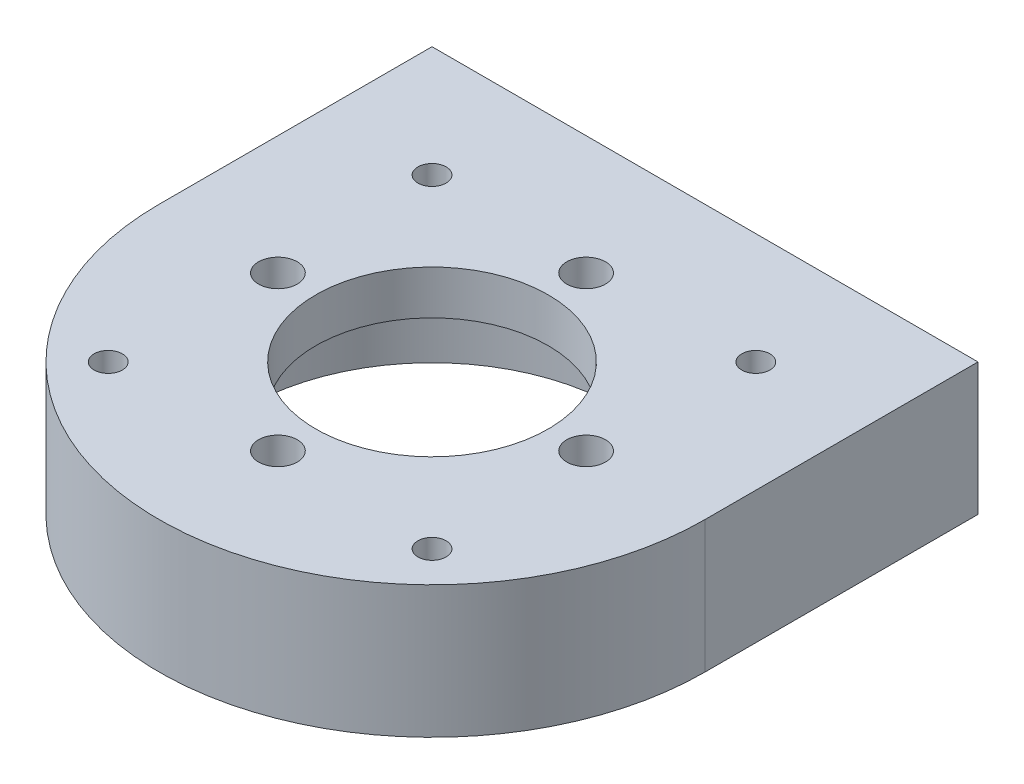
ISO-10303-21;
HEADER;
FILE_DESCRIPTION(('STEP AP214'),'2;1');
FILE_NAME('part.step','',(''),(''),'','','');
FILE_SCHEMA(('AUTOMOTIVE_DESIGN { 1 0 10303 214 1 1 1 1 }'));
ENDSEC;
DATA;
#1=APPLICATION_CONTEXT('core data for automotive mechanical design processes');
#2=APPLICATION_PROTOCOL_DEFINITION('international standard','automotive_design',2000,#1);
#3=PRODUCT_CONTEXT('',#1,'mechanical');
#4=PRODUCT('Part','Part','',(#3));
#5=PRODUCT_RELATED_PRODUCT_CATEGORY('part','',(#4));
#6=PRODUCT_DEFINITION_FORMATION('','',#4);
#7=PRODUCT_DEFINITION_CONTEXT('part definition',#1,'design');
#8=PRODUCT_DEFINITION('design','',#6,#7);
#9=PRODUCT_DEFINITION_SHAPE('','',#8);
#10=(LENGTH_UNIT() NAMED_UNIT(*) SI_UNIT(.MILLI.,.METRE.));
#11=(NAMED_UNIT(*) PLANE_ANGLE_UNIT() SI_UNIT($,.RADIAN.));
#12=(NAMED_UNIT(*) SI_UNIT($,.STERADIAN.) SOLID_ANGLE_UNIT());
#13=UNCERTAINTY_MEASURE_WITH_UNIT(LENGTH_MEASURE(1.E-05),#10,'distance_accuracy_value','');
#14=(GEOMETRIC_REPRESENTATION_CONTEXT(3) GLOBAL_UNCERTAINTY_ASSIGNED_CONTEXT((#13)) GLOBAL_UNIT_ASSIGNED_CONTEXT((#10,
#11,#12)) REPRESENTATION_CONTEXT('',''));
#15=CARTESIAN_POINT('',(0.,0.,0.));
#16=DIRECTION('',(0.,0.,1.));
#17=DIRECTION('',(1.,0.,0.));
#18=AXIS2_PLACEMENT_3D('',#15,#16,#17);
#19=CARTESIAN_POINT('',(0.,15.,0.));
#20=DIRECTION('',(0.,-1.,0.));
#21=DIRECTION('',(0.,0.,-1.));
#22=AXIS2_PLACEMENT_3D('',#19,#20,#21);
#23=CYLINDRICAL_SURFACE('',#22,31.);
#24=CARTESIAN_POINT('',(0.,0.,0.));
#25=DIRECTION('',(0.,1.,0.));
#26=DIRECTION('',(0.,0.,1.));
#27=AXIS2_PLACEMENT_3D('',#24,#25,#26);
#28=CIRCLE('',#27,31.);
#29=CARTESIAN_POINT('',(-31.,0.,0.));
#30=VERTEX_POINT('',#29);
#31=CARTESIAN_POINT('',(31.,0.,0.));
#32=VERTEX_POINT('',#31);
#33=EDGE_CURVE('E141',#30,#32,#28,.T.);
#34=ORIENTED_EDGE('',*,*,#33,.T.);
#35=DIRECTION('',(0.,-1.,0.));
#36=VECTOR('',#35,1.);
#37=CARTESIAN_POINT('',(31.,15.,0.));
#38=LINE('',#37,#36);
#39=CARTESIAN_POINT('',(31.,15.,0.));
#40=VERTEX_POINT('',#39);
#41=EDGE_CURVE('E57',#40,#32,#38,.T.);
#42=ORIENTED_EDGE('',*,*,#41,.F.);
#43=CARTESIAN_POINT('',(0.,15.,0.));
#44=DIRECTION('',(0.,1.,0.));
#45=DIRECTION('',(0.,0.,1.));
#46=AXIS2_PLACEMENT_3D('',#43,#44,#45);
#47=CIRCLE('',#46,31.);
#48=CARTESIAN_POINT('',(-31.,15.,0.));
#49=VERTEX_POINT('',#48);
#50=EDGE_CURVE('E90',#49,#40,#47,.T.);
#51=ORIENTED_EDGE('',*,*,#50,.F.);
#52=DIRECTION('',(0.,-1.,0.));
#53=VECTOR('',#52,1.);
#54=CARTESIAN_POINT('',(-31.,15.,0.));
#55=LINE('',#54,#53);
#56=EDGE_CURVE('E65',#49,#30,#55,.T.);
#57=ORIENTED_EDGE('',*,*,#56,.T.);
#58=EDGE_LOOP('',(#34,#42,#51,#57));
#59=FACE_BOUND('',#58,.T.);
#60=ADVANCED_FACE('F47',(#59),#23,.T.);
#61=CARTESIAN_POINT('',(31.,15.,0.));
#62=DIRECTION('',(1.,0.,0.));
#63=DIRECTION('',(0.,0.,-1.));
#64=AXIS2_PLACEMENT_3D('',#61,#62,#63);
#65=PLANE('',#64);
#66=DIRECTION('',(0.,0.,1.));
#67=VECTOR('',#66,1.);
#68=CARTESIAN_POINT('',(31.,0.,0.));
#69=LINE('',#68,#67);
#70=CARTESIAN_POINT('',(31.,0.,-31.));
#71=VERTEX_POINT('',#70);
#72=EDGE_CURVE('E100',#71,#32,#69,.T.);
#73=ORIENTED_EDGE('',*,*,#72,.F.);
#74=DIRECTION('',(0.,-1.,0.));
#75=VECTOR('',#74,1.);
#76=CARTESIAN_POINT('',(31.,15.,-31.));
#77=LINE('',#76,#75);
#78=CARTESIAN_POINT('',(31.,15.,-31.));
#79=VERTEX_POINT('',#78);
#80=EDGE_CURVE('E96',#79,#71,#77,.T.);
#81=ORIENTED_EDGE('',*,*,#80,.F.);
#82=DIRECTION('',(0.,0.,1.));
#83=VECTOR('',#82,1.);
#84=CARTESIAN_POINT('',(31.,15.,0.));
#85=LINE('',#84,#83);
#86=EDGE_CURVE('E98',#79,#40,#85,.T.);
#87=ORIENTED_EDGE('',*,*,#86,.T.);
#88=ORIENTED_EDGE('',*,*,#41,.T.);
#89=EDGE_LOOP('',(#73,#81,#87,#88));
#90=FACE_BOUND('',#89,.T.);
#91=ADVANCED_FACE('F97',(#90),#65,.T.);
#92=CARTESIAN_POINT('',(0.,15.,-31.));
#93=DIRECTION('',(0.,0.,-1.));
#94=DIRECTION('',(-1.,0.,0.));
#95=AXIS2_PLACEMENT_3D('',#92,#93,#94);
#96=PLANE('',#95);
#97=DIRECTION('',(1.,0.,0.));
#98=VECTOR('',#97,1.);
#99=CARTESIAN_POINT('',(0.,0.,-31.));
#100=LINE('',#99,#98);
#101=CARTESIAN_POINT('',(-31.,0.,-31.));
#102=VERTEX_POINT('',#101);
#103=EDGE_CURVE('E146',#102,#71,#100,.T.);
#104=ORIENTED_EDGE('',*,*,#103,.F.);
#105=DIRECTION('',(0.,-1.,0.));
#106=VECTOR('',#105,1.);
#107=CARTESIAN_POINT('',(-31.,15.,-31.));
#108=LINE('',#107,#106);
#109=CARTESIAN_POINT('',(-31.,15.,-31.));
#110=VERTEX_POINT('',#109);
#111=EDGE_CURVE('E79',#110,#102,#108,.T.);
#112=ORIENTED_EDGE('',*,*,#111,.F.);
#113=DIRECTION('',(1.,0.,0.));
#114=VECTOR('',#113,1.);
#115=CARTESIAN_POINT('',(0.,15.,-31.));
#116=LINE('',#115,#114);
#117=EDGE_CURVE('E109',#110,#79,#116,.T.);
#118=ORIENTED_EDGE('',*,*,#117,.T.);
#119=ORIENTED_EDGE('',*,*,#80,.T.);
#120=EDGE_LOOP('',(#104,#112,#118,#119));
#121=FACE_BOUND('',#120,.T.);
#122=ADVANCED_FACE('F112',(#121),#96,.T.);
#123=CARTESIAN_POINT('',(0.,15.,0.));
#124=DIRECTION('',(0.,-1.,0.));
#125=DIRECTION('',(0.,0.,-1.));
#126=AXIS2_PLACEMENT_3D('',#123,#124,#125);
#127=CYLINDRICAL_SURFACE('',#126,21.1);
#128=CARTESIAN_POINT('',(0.,10.,0.));
#129=DIRECTION('',(0.,-1.,0.));
#130=DIRECTION('',(0.,0.,-1.));
#131=AXIS2_PLACEMENT_3D('',#128,#129,#130);
#132=CIRCLE('',#131,21.1);
#133=CARTESIAN_POINT('',(0.,10.,-21.1));
#134=VERTEX_POINT('',#133);
#135=EDGE_CURVE('E11',#134,#134,#132,.T.);
#136=ORIENTED_EDGE('',*,*,#135,.F.);
#137=EDGE_LOOP('',(#136));
#138=FACE_BOUND('',#137,.T.);
#139=CARTESIAN_POINT('',(0.,0.,0.));
#140=DIRECTION('',(0.,1.,0.));
#141=DIRECTION('',(0.,0.,1.));
#142=AXIS2_PLACEMENT_3D('',#139,#140,#141);
#143=CIRCLE('',#142,21.1);
#144=CARTESIAN_POINT('',(0.,0.,21.1));
#145=VERTEX_POINT('',#144);
#146=EDGE_CURVE('E137',#145,#145,#143,.T.);
#147=ORIENTED_EDGE('',*,*,#146,.F.);
#148=EDGE_LOOP('',(#147));
#149=FACE_BOUND('',#148,.T.);
#150=ADVANCED_FACE('F181',(#138,#149),#127,.F.);
#151=CARTESIAN_POINT('',(18.3847763108503,15.,-18.3847763108502));
#152=DIRECTION('',(0.,-1.,0.));
#153=DIRECTION('',(0.,0.,-1.));
#154=AXIS2_PLACEMENT_3D('',#151,#152,#153);
#155=CYLINDRICAL_SURFACE('',#154,1.60000000000001);
#156=CARTESIAN_POINT('',(18.3847763108503,15.,-18.3847763108502));
#157=DIRECTION('',(0.,1.,0.));
#158=DIRECTION('',(0.,0.,1.));
#159=AXIS2_PLACEMENT_3D('',#156,#157,#158);
#160=CIRCLE('',#159,1.60000000000001);
#161=CARTESIAN_POINT('',(18.3847763108503,15.,-16.7847763108502));
#162=VERTEX_POINT('',#161);
#163=EDGE_CURVE('E292',#162,#162,#160,.T.);
#164=ORIENTED_EDGE('',*,*,#163,.T.);
#165=EDGE_LOOP('',(#164));
#166=FACE_BOUND('',#165,.T.);
#167=CARTESIAN_POINT('',(18.3847763108503,0.,-18.3847763108502));
#168=DIRECTION('',(0.,1.,0.));
#169=DIRECTION('',(0.,0.,1.));
#170=AXIS2_PLACEMENT_3D('',#167,#168,#169);
#171=CIRCLE('',#170,1.60000000000001);
#172=CARTESIAN_POINT('',(18.3847763108503,0.,-16.7847763108502));
#173=VERTEX_POINT('',#172);
#174=EDGE_CURVE('E133',#173,#173,#171,.T.);
#175=ORIENTED_EDGE('',*,*,#174,.F.);
#176=EDGE_LOOP('',(#175));
#177=FACE_BOUND('',#176,.T.);
#178=ADVANCED_FACE('F184',(#166,#177),#155,.F.);
#179=CARTESIAN_POINT('',(18.3847763108501,15.,18.3847763108503));
#180=DIRECTION('',(0.,-1.,0.));
#181=DIRECTION('',(0.,0.,-1.));
#182=AXIS2_PLACEMENT_3D('',#179,#180,#181);
#183=CYLINDRICAL_SURFACE('',#182,1.6);
#184=CARTESIAN_POINT('',(18.3847763108501,15.,18.3847763108503));
#185=DIRECTION('',(0.,1.,0.));
#186=DIRECTION('',(0.,0.,1.));
#187=AXIS2_PLACEMENT_3D('',#184,#185,#186);
#188=CIRCLE('',#187,1.6);
#189=CARTESIAN_POINT('',(18.3847763108501,15.,19.9847763108503));
#190=VERTEX_POINT('',#189);
#191=EDGE_CURVE('E288',#190,#190,#188,.T.);
#192=ORIENTED_EDGE('',*,*,#191,.T.);
#193=EDGE_LOOP('',(#192));
#194=FACE_BOUND('',#193,.T.);
#195=CARTESIAN_POINT('',(18.3847763108501,0.,18.3847763108503));
#196=DIRECTION('',(0.,1.,0.));
#197=DIRECTION('',(0.,0.,1.));
#198=AXIS2_PLACEMENT_3D('',#195,#196,#197);
#199=CIRCLE('',#198,1.6);
#200=CARTESIAN_POINT('',(18.3847763108501,0.,19.9847763108503));
#201=VERTEX_POINT('',#200);
#202=EDGE_CURVE('E129',#201,#201,#199,.T.);
#203=ORIENTED_EDGE('',*,*,#202,.F.);
#204=EDGE_LOOP('',(#203));
#205=FACE_BOUND('',#204,.T.);
#206=ADVANCED_FACE('F188',(#194,#205),#183,.F.);
#207=CARTESIAN_POINT('',(-18.3847763108504,15.,18.3847763108501));
#208=DIRECTION('',(0.,-1.,0.));
#209=DIRECTION('',(0.,0.,-1.));
#210=AXIS2_PLACEMENT_3D('',#207,#208,#209);
#211=CYLINDRICAL_SURFACE('',#210,1.6);
#212=CARTESIAN_POINT('',(-18.3847763108504,15.,18.3847763108501));
#213=DIRECTION('',(0.,1.,0.));
#214=DIRECTION('',(0.,0.,1.));
#215=AXIS2_PLACEMENT_3D('',#212,#213,#214);
#216=CIRCLE('',#215,1.6);
#217=CARTESIAN_POINT('',(-18.3847763108504,15.,19.9847763108501));
#218=VERTEX_POINT('',#217);
#219=EDGE_CURVE('E199',#218,#218,#216,.T.);
#220=ORIENTED_EDGE('',*,*,#219,.T.);
#221=EDGE_LOOP('',(#220));
#222=FACE_BOUND('',#221,.T.);
#223=CARTESIAN_POINT('',(-18.3847763108504,0.,18.3847763108501));
#224=DIRECTION('',(0.,1.,0.));
#225=DIRECTION('',(0.,0.,1.));
#226=AXIS2_PLACEMENT_3D('',#223,#224,#225);
#227=CIRCLE('',#226,1.6);
#228=CARTESIAN_POINT('',(-18.3847763108504,0.,19.9847763108501));
#229=VERTEX_POINT('',#228);
#230=EDGE_CURVE('E124',#229,#229,#227,.T.);
#231=ORIENTED_EDGE('',*,*,#230,.F.);
#232=EDGE_LOOP('',(#231));
#233=FACE_BOUND('',#232,.T.);
#234=ADVANCED_FACE('F170',(#222,#233),#211,.F.);
#235=CARTESIAN_POINT('',(-18.38477631085,15.,-18.3847763108505));
#236=DIRECTION('',(0.,-1.,0.));
#237=DIRECTION('',(0.,0.,-1.));
#238=AXIS2_PLACEMENT_3D('',#235,#236,#237);
#239=CYLINDRICAL_SURFACE('',#238,1.6);
#240=CARTESIAN_POINT('',(-18.38477631085,15.,-18.3847763108505));
#241=DIRECTION('',(0.,1.,0.));
#242=DIRECTION('',(0.,0.,1.));
#243=AXIS2_PLACEMENT_3D('',#240,#241,#242);
#244=CIRCLE('',#243,1.6);
#245=CARTESIAN_POINT('',(-18.38477631085,15.,-16.7847763108505));
#246=VERTEX_POINT('',#245);
#247=EDGE_CURVE('E153',#246,#246,#244,.T.);
#248=ORIENTED_EDGE('',*,*,#247,.T.);
#249=EDGE_LOOP('',(#248));
#250=FACE_BOUND('',#249,.T.);
#251=CARTESIAN_POINT('',(-18.38477631085,0.,-18.3847763108505));
#252=DIRECTION('',(0.,1.,0.));
#253=DIRECTION('',(0.,0.,1.));
#254=AXIS2_PLACEMENT_3D('',#251,#252,#253);
#255=CIRCLE('',#254,1.6);
#256=CARTESIAN_POINT('',(-18.38477631085,0.,-16.7847763108505));
#257=VERTEX_POINT('',#256);
#258=EDGE_CURVE('E120',#257,#257,#255,.T.);
#259=ORIENTED_EDGE('',*,*,#258,.F.);
#260=EDGE_LOOP('',(#259));
#261=FACE_BOUND('',#260,.T.);
#262=ADVANCED_FACE('F49',(#250,#261),#239,.F.);
#263=CARTESIAN_POINT('',(-31.,15.,0.));
#264=DIRECTION('',(-1.,0.,0.));
#265=DIRECTION('',(0.,0.,1.));
#266=AXIS2_PLACEMENT_3D('',#263,#264,#265);
#267=PLANE('',#266);
#268=DIRECTION('',(0.,0.,-1.));
#269=VECTOR('',#268,1.);
#270=CARTESIAN_POINT('',(-31.,0.,0.));
#271=LINE('',#270,#269);
#272=EDGE_CURVE('E149',#30,#102,#271,.T.);
#273=ORIENTED_EDGE('',*,*,#272,.F.);
#274=ORIENTED_EDGE('',*,*,#56,.F.);
#275=DIRECTION('',(0.,0.,-1.));
#276=VECTOR('',#275,1.);
#277=CARTESIAN_POINT('',(-31.,15.,0.));
#278=LINE('',#277,#276);
#279=EDGE_CURVE('E114',#49,#110,#278,.T.);
#280=ORIENTED_EDGE('',*,*,#279,.T.);
#281=ORIENTED_EDGE('',*,*,#111,.T.);
#282=EDGE_LOOP('',(#273,#274,#280,#281));
#283=FACE_BOUND('',#282,.T.);
#284=ADVANCED_FACE('F160',(#283),#267,.T.);
#285=CARTESIAN_POINT('',(0.,15.,0.));
#286=DIRECTION('',(0.,1.,0.));
#287=DIRECTION('',(0.,0.,1.));
#288=AXIS2_PLACEMENT_3D('',#285,#286,#287);
#289=PLANE('',#288);
#290=ORIENTED_EDGE('',*,*,#247,.F.);
#291=EDGE_LOOP('',(#290));
#292=FACE_BOUND('',#291,.T.);
#293=ORIENTED_EDGE('',*,*,#219,.F.);
#294=EDGE_LOOP('',(#293));
#295=FACE_BOUND('',#294,.T.);
#296=ORIENTED_EDGE('',*,*,#191,.F.);
#297=EDGE_LOOP('',(#296));
#298=FACE_BOUND('',#297,.T.);
#299=ORIENTED_EDGE('',*,*,#163,.F.);
#300=EDGE_LOOP('',(#299));
#301=FACE_BOUND('',#300,.T.);
#302=ORIENTED_EDGE('',*,*,#50,.T.);
#303=ORIENTED_EDGE('',*,*,#86,.F.);
#304=ORIENTED_EDGE('',*,*,#117,.F.);
#305=ORIENTED_EDGE('',*,*,#279,.F.);
#306=EDGE_LOOP('',(#302,#303,#304,#305));
#307=FACE_BOUND('',#306,.T.);
#308=CARTESIAN_POINT('',(-17.5,15.,1.83447007584547E-13));
#309=DIRECTION('',(0.,-1.,0.));
#310=DIRECTION('',(0.,0.,-1.));
#311=AXIS2_PLACEMENT_3D('',#308,#309,#310);
#312=CIRCLE('',#311,2.2);
#313=CARTESIAN_POINT('',(-17.5,15.,-2.19999999999982));
#314=VERTEX_POINT('',#313);
#315=EDGE_CURVE('E243',#314,#314,#312,.T.);
#316=ORIENTED_EDGE('',*,*,#315,.T.);
#317=EDGE_LOOP('',(#316));
#318=FACE_BOUND('',#317,.T.);
#319=CARTESIAN_POINT('',(-1.22298005056365E-13,15.,-17.5));
#320=DIRECTION('',(0.,-1.,0.));
#321=DIRECTION('',(0.,0.,-1.));
#322=AXIS2_PLACEMENT_3D('',#319,#320,#321);
#323=CIRCLE('',#322,2.2);
#324=CARTESIAN_POINT('',(-1.22298005056365E-13,15.,-19.7));
#325=VERTEX_POINT('',#324);
#326=EDGE_CURVE('E253',#325,#325,#323,.T.);
#327=ORIENTED_EDGE('',*,*,#326,.T.);
#328=EDGE_LOOP('',(#327));
#329=FACE_BOUND('',#328,.T.);
#330=CARTESIAN_POINT('',(17.5,15.,0.));
#331=DIRECTION('',(0.,-1.,0.));
#332=DIRECTION('',(0.,0.,-1.));
#333=AXIS2_PLACEMENT_3D('',#330,#331,#332);
#334=CIRCLE('',#333,2.2);
#335=CARTESIAN_POINT('',(17.5,15.,-2.20000000000006));
#336=VERTEX_POINT('',#335);
#337=EDGE_CURVE('E261',#336,#336,#334,.T.);
#338=ORIENTED_EDGE('',*,*,#337,.T.);
#339=EDGE_LOOP('',(#338));
#340=FACE_BOUND('',#339,.T.);
#341=CARTESIAN_POINT('',(0.,15.,17.5));
#342=DIRECTION('',(0.,-1.,0.));
#343=DIRECTION('',(0.,0.,-1.));
#344=AXIS2_PLACEMENT_3D('',#341,#342,#343);
#345=CIRCLE('',#344,2.2);
#346=CARTESIAN_POINT('',(0.,15.,15.3));
#347=VERTEX_POINT('',#346);
#348=EDGE_CURVE('E269',#347,#347,#345,.T.);
#349=ORIENTED_EDGE('',*,*,#348,.T.);
#350=EDGE_LOOP('',(#349));
#351=FACE_BOUND('',#350,.T.);
#352=CARTESIAN_POINT('',(0.,15.,0.));
#353=DIRECTION('',(0.,-1.,0.));
#354=DIRECTION('',(0.,0.,-1.));
#355=AXIS2_PLACEMENT_3D('',#352,#353,#354);
#356=CIRCLE('',#355,13.2);
#357=CARTESIAN_POINT('',(0.,15.,-13.2));
#358=VERTEX_POINT('',#357);
#359=EDGE_CURVE('E125',#358,#358,#356,.T.);
#360=ORIENTED_EDGE('',*,*,#359,.T.);
#361=EDGE_LOOP('',(#360));
#362=FACE_BOUND('',#361,.T.);
#363=ADVANCED_FACE('F107',(#292,#295,#298,#301,#307,#318,#329,#340,#351,#362),#289,.T.);
#364=CARTESIAN_POINT('',(0.,0.,0.));
#365=DIRECTION('',(0.,1.,0.));
#366=DIRECTION('',(0.,0.,1.));
#367=AXIS2_PLACEMENT_3D('',#364,#365,#366);
#368=PLANE('',#367);
#369=ORIENTED_EDGE('',*,*,#258,.T.);
#370=EDGE_LOOP('',(#369));
#371=FACE_BOUND('',#370,.T.);
#372=ORIENTED_EDGE('',*,*,#230,.T.);
#373=EDGE_LOOP('',(#372));
#374=FACE_BOUND('',#373,.T.);
#375=ORIENTED_EDGE('',*,*,#202,.T.);
#376=EDGE_LOOP('',(#375));
#377=FACE_BOUND('',#376,.T.);
#378=ORIENTED_EDGE('',*,*,#174,.T.);
#379=EDGE_LOOP('',(#378));
#380=FACE_BOUND('',#379,.T.);
#381=ORIENTED_EDGE('',*,*,#146,.T.);
#382=EDGE_LOOP('',(#381));
#383=FACE_BOUND('',#382,.T.);
#384=ORIENTED_EDGE('',*,*,#33,.F.);
#385=ORIENTED_EDGE('',*,*,#272,.T.);
#386=ORIENTED_EDGE('',*,*,#103,.T.);
#387=ORIENTED_EDGE('',*,*,#72,.T.);
#388=EDGE_LOOP('',(#384,#385,#386,#387));
#389=FACE_BOUND('',#388,.T.);
#390=ADVANCED_FACE('F159',(#371,#374,#377,#380,#383,#389),#368,.F.);
#391=CARTESIAN_POINT('',(0.,10.,0.));
#392=DIRECTION('',(0.,-1.,0.));
#393=DIRECTION('',(0.,0.,-1.));
#394=AXIS2_PLACEMENT_3D('',#391,#392,#393);
#395=PLANE('',#394);
#396=CARTESIAN_POINT('',(-17.5,10.,1.83447007584547E-13));
#397=DIRECTION('',(0.,-1.,0.));
#398=DIRECTION('',(0.,0.,-1.));
#399=AXIS2_PLACEMENT_3D('',#396,#397,#398);
#400=CIRCLE('',#399,2.2);
#401=CARTESIAN_POINT('',(-17.5,10.,-2.19999999999982));
#402=VERTEX_POINT('',#401);
#403=EDGE_CURVE('E246',#402,#402,#400,.T.);
#404=ORIENTED_EDGE('',*,*,#403,.F.);
#405=EDGE_LOOP('',(#404));
#406=FACE_BOUND('',#405,.T.);
#407=CARTESIAN_POINT('',(-1.22298005056365E-13,10.,-17.5));
#408=DIRECTION('',(0.,-1.,0.));
#409=DIRECTION('',(0.,0.,-1.));
#410=AXIS2_PLACEMENT_3D('',#407,#408,#409);
#411=CIRCLE('',#410,2.2);
#412=CARTESIAN_POINT('',(-1.22298005056365E-13,10.,-19.7));
#413=VERTEX_POINT('',#412);
#414=EDGE_CURVE('E250',#413,#413,#411,.T.);
#415=ORIENTED_EDGE('',*,*,#414,.F.);
#416=EDGE_LOOP('',(#415));
#417=FACE_BOUND('',#416,.T.);
#418=CARTESIAN_POINT('',(17.5,10.,0.));
#419=DIRECTION('',(0.,-1.,0.));
#420=DIRECTION('',(0.,0.,-1.));
#421=AXIS2_PLACEMENT_3D('',#418,#419,#420);
#422=CIRCLE('',#421,2.2);
#423=CARTESIAN_POINT('',(17.5,10.,-2.20000000000006));
#424=VERTEX_POINT('',#423);
#425=EDGE_CURVE('E257',#424,#424,#422,.T.);
#426=ORIENTED_EDGE('',*,*,#425,.F.);
#427=EDGE_LOOP('',(#426));
#428=FACE_BOUND('',#427,.T.);
#429=CARTESIAN_POINT('',(0.,10.,17.5));
#430=DIRECTION('',(0.,-1.,0.));
#431=DIRECTION('',(0.,0.,-1.));
#432=AXIS2_PLACEMENT_3D('',#429,#430,#431);
#433=CIRCLE('',#432,2.2);
#434=CARTESIAN_POINT('',(0.,10.,15.3));
#435=VERTEX_POINT('',#434);
#436=EDGE_CURVE('E265',#435,#435,#433,.T.);
#437=ORIENTED_EDGE('',*,*,#436,.F.);
#438=EDGE_LOOP('',(#437));
#439=FACE_BOUND('',#438,.T.);
#440=CARTESIAN_POINT('',(0.,10.,0.));
#441=DIRECTION('',(0.,-1.,0.));
#442=DIRECTION('',(0.,0.,-1.));
#443=AXIS2_PLACEMENT_3D('',#440,#441,#442);
#444=CIRCLE('',#443,13.2);
#445=CARTESIAN_POINT('',(0.,10.,-13.2));
#446=VERTEX_POINT('',#445);
#447=EDGE_CURVE('E273',#446,#446,#444,.T.);
#448=ORIENTED_EDGE('',*,*,#447,.F.);
#449=EDGE_LOOP('',(#448));
#450=FACE_BOUND('',#449,.T.);
#451=ORIENTED_EDGE('',*,*,#135,.T.);
#452=EDGE_LOOP('',(#451));
#453=FACE_BOUND('',#452,.T.);
#454=ADVANCED_FACE('F203',(#406,#417,#428,#439,#450,#453),#395,.T.);
#455=CARTESIAN_POINT('',(0.,15.,0.));
#456=DIRECTION('',(0.,-1.,0.));
#457=DIRECTION('',(0.,0.,-1.));
#458=AXIS2_PLACEMENT_3D('',#455,#456,#457);
#459=CYLINDRICAL_SURFACE('',#458,13.2);
#460=ORIENTED_EDGE('',*,*,#359,.F.);
#461=EDGE_LOOP('',(#460));
#462=FACE_BOUND('',#461,.T.);
#463=ORIENTED_EDGE('',*,*,#447,.T.);
#464=EDGE_LOOP('',(#463));
#465=FACE_BOUND('',#464,.T.);
#466=ADVANCED_FACE('F216',(#462,#465),#459,.F.);
#467=CARTESIAN_POINT('',(0.,15.,17.5));
#468=DIRECTION('',(0.,-1.,0.));
#469=DIRECTION('',(0.,0.,-1.));
#470=AXIS2_PLACEMENT_3D('',#467,#468,#469);
#471=CYLINDRICAL_SURFACE('',#470,2.2);
#472=ORIENTED_EDGE('',*,*,#348,.F.);
#473=EDGE_LOOP('',(#472));
#474=FACE_BOUND('',#473,.T.);
#475=ORIENTED_EDGE('',*,*,#436,.T.);
#476=EDGE_LOOP('',(#475));
#477=FACE_BOUND('',#476,.T.);
#478=ADVANCED_FACE('F222',(#474,#477),#471,.F.);
#479=CARTESIAN_POINT('',(17.5,15.,0.));
#480=DIRECTION('',(0.,-1.,0.));
#481=DIRECTION('',(0.,0.,-1.));
#482=AXIS2_PLACEMENT_3D('',#479,#480,#481);
#483=CYLINDRICAL_SURFACE('',#482,2.2);
#484=ORIENTED_EDGE('',*,*,#337,.F.);
#485=EDGE_LOOP('',(#484));
#486=FACE_BOUND('',#485,.T.);
#487=ORIENTED_EDGE('',*,*,#425,.T.);
#488=EDGE_LOOP('',(#487));
#489=FACE_BOUND('',#488,.T.);
#490=ADVANCED_FACE('F226',(#486,#489),#483,.F.);
#491=CARTESIAN_POINT('',(-1.22298005056365E-13,15.,-17.5));
#492=DIRECTION('',(0.,-1.,0.));
#493=DIRECTION('',(0.,0.,-1.));
#494=AXIS2_PLACEMENT_3D('',#491,#492,#493);
#495=CYLINDRICAL_SURFACE('',#494,2.2);
#496=ORIENTED_EDGE('',*,*,#326,.F.);
#497=EDGE_LOOP('',(#496));
#498=FACE_BOUND('',#497,.T.);
#499=ORIENTED_EDGE('',*,*,#414,.T.);
#500=EDGE_LOOP('',(#499));
#501=FACE_BOUND('',#500,.T.);
#502=ADVANCED_FACE('F230',(#498,#501),#495,.F.);
#503=CARTESIAN_POINT('',(-17.5,15.,1.83447007584547E-13));
#504=DIRECTION('',(0.,-1.,0.));
#505=DIRECTION('',(0.,0.,-1.));
#506=AXIS2_PLACEMENT_3D('',#503,#504,#505);
#507=CYLINDRICAL_SURFACE('',#506,2.2);
#508=ORIENTED_EDGE('',*,*,#315,.F.);
#509=EDGE_LOOP('',(#508));
#510=FACE_BOUND('',#509,.T.);
#511=ORIENTED_EDGE('',*,*,#403,.T.);
#512=EDGE_LOOP('',(#511));
#513=FACE_BOUND('',#512,.T.);
#514=ADVANCED_FACE('F234',(#510,#513),#507,.F.);
#515=CLOSED_SHELL('',(#60,#91,#122,#150,#178,#206,#234,#262,#284,#363,#390,#454,#466,#478,#490,
#502,#514));
#516=MANIFOLD_SOLID_BREP('B2',#515);
#517=ADVANCED_BREP_SHAPE_REPRESENTATION('',(#18,#516),#14);
#518=SHAPE_DEFINITION_REPRESENTATION(#9,#517);
ENDSEC;
END-ISO-10303-21;
